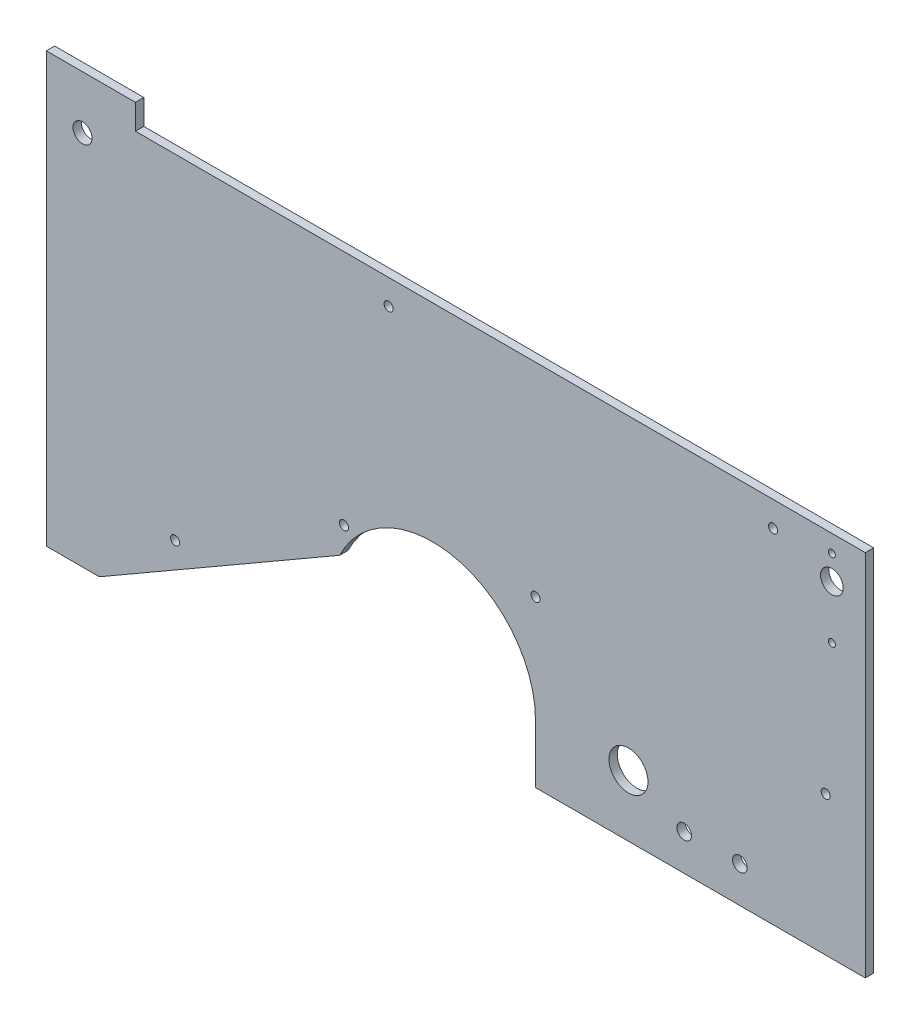
ISO-10303-21;
HEADER;
FILE_DESCRIPTION(('STEP AP214'),'2;1');
FILE_NAME('part.step','',(''),(''),'','','');
FILE_SCHEMA(('AUTOMOTIVE_DESIGN { 1 0 10303 214 1 1 1 1 }'));
ENDSEC;
DATA;
#1=APPLICATION_CONTEXT('core data for automotive mechanical design processes');
#2=APPLICATION_PROTOCOL_DEFINITION('international standard','automotive_design',2000,#1);
#3=PRODUCT_CONTEXT('',#1,'mechanical');
#4=PRODUCT('Part','Part','',(#3));
#5=PRODUCT_RELATED_PRODUCT_CATEGORY('part','',(#4));
#6=PRODUCT_DEFINITION_FORMATION('','',#4);
#7=PRODUCT_DEFINITION_CONTEXT('part definition',#1,'design');
#8=PRODUCT_DEFINITION('design','',#6,#7);
#9=PRODUCT_DEFINITION_SHAPE('','',#8);
#10=(LENGTH_UNIT() NAMED_UNIT(*) SI_UNIT(.MILLI.,.METRE.));
#11=(NAMED_UNIT(*) PLANE_ANGLE_UNIT() SI_UNIT($,.RADIAN.));
#12=(NAMED_UNIT(*) SI_UNIT($,.STERADIAN.) SOLID_ANGLE_UNIT());
#13=UNCERTAINTY_MEASURE_WITH_UNIT(LENGTH_MEASURE(1.E-05),#10,'distance_accuracy_value','');
#14=(GEOMETRIC_REPRESENTATION_CONTEXT(3) GLOBAL_UNCERTAINTY_ASSIGNED_CONTEXT((#13)) GLOBAL_UNIT_ASSIGNED_CONTEXT((#10,
#11,#12)) REPRESENTATION_CONTEXT('',''));
#15=CARTESIAN_POINT('',(0.,0.,0.));
#16=DIRECTION('',(0.,0.,1.));
#17=DIRECTION('',(1.,0.,0.));
#18=AXIS2_PLACEMENT_3D('',#15,#16,#17);
#19=CARTESIAN_POINT('',(144.6,33.7,3.));
#20=DIRECTION('',(0.,0.,1.));
#21=DIRECTION('',(1.,0.,0.));
#22=AXIS2_PLACEMENT_3D('',#19,#20,#21);
#23=PLANE('',#22);
#24=CARTESIAN_POINT('',(112.84,59.93,3.));
#25=DIRECTION('',(0.,0.,1.));
#26=DIRECTION('',(1.,0.,0.));
#27=AXIS2_PLACEMENT_3D('',#24,#25,#26);
#28=CIRCLE('',#27,1.625);
#29=CARTESIAN_POINT('',(114.465,59.93,3.));
#30=VERTEX_POINT('',#29);
#31=EDGE_CURVE('E220',#30,#30,#28,.T.);
#32=ORIENTED_EDGE('',*,*,#31,.F.);
#33=EDGE_LOOP('',(#32));
#34=FACE_BOUND('',#33,.T.);
#35=CARTESIAN_POINT('',(52.23,24.91,3.));
#36=DIRECTION('',(0.,0.,1.));
#37=DIRECTION('',(1.,0.,0.));
#38=AXIS2_PLACEMENT_3D('',#35,#36,#37);
#39=CIRCLE('',#38,1.625);
#40=CARTESIAN_POINT('',(53.855,24.91,3.));
#41=VERTEX_POINT('',#40);
#42=EDGE_CURVE('E242',#41,#41,#39,.T.);
#43=ORIENTED_EDGE('',*,*,#42,.F.);
#44=EDGE_LOOP('',(#43));
#45=FACE_BOUND('',#44,.T.);
#46=CARTESIAN_POINT('',(285.78,62.92,3.));
#47=DIRECTION('',(0.,0.,1.));
#48=DIRECTION('',(1.,0.,0.));
#49=AXIS2_PLACEMENT_3D('',#46,#47,#48);
#50=CIRCLE('',#49,1.62499999999998);
#51=CARTESIAN_POINT('',(287.405,62.92,3.));
#52=VERTEX_POINT('',#51);
#53=EDGE_CURVE('E236',#52,#52,#50,.T.);
#54=ORIENTED_EDGE('',*,*,#53,.F.);
#55=EDGE_LOOP('',(#54));
#56=FACE_BOUND('',#55,.T.);
#57=CARTESIAN_POINT('',(181.6,72.03,3.));
#58=DIRECTION('',(0.,0.,1.));
#59=DIRECTION('',(1.,0.,0.));
#60=AXIS2_PLACEMENT_3D('',#57,#58,#59);
#61=CIRCLE('',#60,1.62499999999998);
#62=CARTESIAN_POINT('',(183.225,72.03,3.));
#63=VERTEX_POINT('',#62);
#64=EDGE_CURVE('E230',#63,#63,#61,.T.);
#65=ORIENTED_EDGE('',*,*,#64,.F.);
#66=EDGE_LOOP('',(#65));
#67=FACE_BOUND('',#66,.T.);
#68=CARTESIAN_POINT('',(234.98,25.75,3.));
#69=DIRECTION('',(0.,0.,1.));
#70=DIRECTION('',(1.,0.,0.));
#71=AXIS2_PLACEMENT_3D('',#68,#69,#70);
#72=CIRCLE('',#71,2.625);
#73=CARTESIAN_POINT('',(237.605,25.75,3.));
#74=VERTEX_POINT('',#73);
#75=EDGE_CURVE('E266',#74,#74,#72,.T.);
#76=ORIENTED_EDGE('',*,*,#75,.F.);
#77=EDGE_LOOP('',(#76));
#78=FACE_BOUND('',#77,.T.);
#79=CARTESIAN_POINT('',(288.,130.,3.));
#80=DIRECTION('',(0.,0.,1.));
#81=DIRECTION('',(1.,0.,0.));
#82=AXIS2_PLACEMENT_3D('',#79,#80,#81);
#83=CIRCLE('',#82,4.07499999999998);
#84=CARTESIAN_POINT('',(292.075,130.,3.));
#85=VERTEX_POINT('',#84);
#86=EDGE_CURVE('E253',#85,#85,#83,.T.);
#87=ORIENTED_EDGE('',*,*,#86,.F.);
#88=EDGE_LOOP('',(#87));
#89=FACE_BOUND('',#88,.T.);
#90=CARTESIAN_POINT('',(288.,138.75,3.));
#91=DIRECTION('',(0.,0.,1.));
#92=DIRECTION('',(1.,0.,0.));
#93=AXIS2_PLACEMENT_3D('',#90,#91,#92);
#94=CIRCLE('',#93,1.24999999999996);
#95=CARTESIAN_POINT('',(289.25,138.75,3.));
#96=VERTEX_POINT('',#95);
#97=EDGE_CURVE('E254',#96,#96,#94,.T.);
#98=ORIENTED_EDGE('',*,*,#97,.F.);
#99=EDGE_LOOP('',(#98));
#100=FACE_BOUND('',#99,.T.);
#101=CARTESIAN_POINT('',(288.,110.95,3.));
#102=DIRECTION('',(0.,0.,1.));
#103=DIRECTION('',(1.,0.,0.));
#104=AXIS2_PLACEMENT_3D('',#101,#102,#103);
#105=CIRCLE('',#104,1.24999999999995);
#106=CARTESIAN_POINT('',(289.25,110.95,3.));
#107=VERTEX_POINT('',#106);
#108=EDGE_CURVE('E229',#107,#107,#105,.T.);
#109=ORIENTED_EDGE('',*,*,#108,.F.);
#110=EDGE_LOOP('',(#109));
#111=FACE_BOUND('',#110,.T.);
#112=CARTESIAN_POINT('',(214.98,34.75,3.));
#113=DIRECTION('',(0.,0.,1.));
#114=DIRECTION('',(1.,0.,0.));
#115=AXIS2_PLACEMENT_3D('',#112,#113,#114);
#116=CIRCLE('',#115,7.00000000000001);
#117=CARTESIAN_POINT('',(221.98,34.75,3.));
#118=VERTEX_POINT('',#117);
#119=EDGE_CURVE('E214',#118,#118,#116,.T.);
#120=ORIENTED_EDGE('',*,*,#119,.F.);
#121=EDGE_LOOP('',(#120));
#122=FACE_BOUND('',#121,.T.);
#123=DIRECTION('',(0.,1.,0.));
#124=VECTOR('',#123,1.);
#125=CARTESIAN_POINT('',(6.,154.,3.));
#126=LINE('',#125,#124);
#127=CARTESIAN_POINT('',(6.00000000000002,0.,3.));
#128=VERTEX_POINT('',#127);
#129=CARTESIAN_POINT('',(6.00000000000002,154.,3.));
#130=VERTEX_POINT('',#129);
#131=EDGE_CURVE('E53',#128,#130,#126,.T.);
#132=ORIENTED_EDGE('',*,*,#131,.F.);
#133=DIRECTION('',(1.,0.,0.));
#134=VECTOR('',#133,1.);
#135=CARTESIAN_POINT('',(0.,0.,3.));
#136=LINE('',#135,#134);
#137=CARTESIAN_POINT('',(25.030359010412,0.,3.));
#138=VERTEX_POINT('',#137);
#139=EDGE_CURVE('E126',#128,#138,#136,.T.);
#140=ORIENTED_EDGE('',*,*,#139,.T.);
#141=DIRECTION('',(0.866025403784438,0.500000000000001,0.));
#142=VECTOR('',#141,1.);
#143=CARTESIAN_POINT('',(25.030359010412,0.,3.));
#144=LINE('',#143,#142);
#145=CARTESIAN_POINT('',(111.286489227342,49.8000000000001,3.));
#146=VERTEX_POINT('',#145);
#147=EDGE_CURVE('E192',#138,#146,#144,.T.);
#148=ORIENTED_EDGE('',*,*,#147,.T.);
#149=CARTESIAN_POINT('',(144.6,33.7,3.));
#150=DIRECTION('',(0.,0.,-1.));
#151=DIRECTION('',(1.,0.,0.));
#152=AXIS2_PLACEMENT_3D('',#149,#150,#151);
#153=CIRCLE('',#152,37.);
#154=CARTESIAN_POINT('',(181.6,33.7,3.));
#155=VERTEX_POINT('',#154);
#156=EDGE_CURVE('E174',#146,#155,#153,.T.);
#157=ORIENTED_EDGE('',*,*,#156,.T.);
#158=DIRECTION('',(0.,-1.,0.));
#159=VECTOR('',#158,1.);
#160=CARTESIAN_POINT('',(181.6,33.7,3.));
#161=LINE('',#160,#159);
#162=CARTESIAN_POINT('',(181.6,12.75,3.));
#163=VERTEX_POINT('',#162);
#164=EDGE_CURVE('E185',#155,#163,#161,.T.);
#165=ORIENTED_EDGE('',*,*,#164,.T.);
#166=DIRECTION('',(-1.,0.,0.));
#167=VECTOR('',#166,1.);
#168=CARTESIAN_POINT('',(181.6,12.75,3.));
#169=LINE('',#168,#167);
#170=CARTESIAN_POINT('',(300.,12.75,3.));
#171=VERTEX_POINT('',#170);
#172=EDGE_CURVE('E277',#171,#163,#169,.T.);
#173=ORIENTED_EDGE('',*,*,#172,.F.);
#174=DIRECTION('',(0.,1.,0.));
#175=VECTOR('',#174,1.);
#176=CARTESIAN_POINT('',(300.,0.,3.));
#177=LINE('',#176,#175);
#178=CARTESIAN_POINT('',(300.,145.,3.));
#179=VERTEX_POINT('',#178);
#180=EDGE_CURVE('E188',#171,#179,#177,.T.);
#181=ORIENTED_EDGE('',*,*,#180,.T.);
#182=DIRECTION('',(-1.,0.,0.));
#183=VECTOR('',#182,1.);
#184=CARTESIAN_POINT('',(38.,145.,3.));
#185=LINE('',#184,#183);
#186=CARTESIAN_POINT('',(38.,145.,3.));
#187=VERTEX_POINT('',#186);
#188=EDGE_CURVE('E190',#179,#187,#185,.T.);
#189=ORIENTED_EDGE('',*,*,#188,.T.);
#190=DIRECTION('',(0.,1.,0.));
#191=VECTOR('',#190,1.);
#192=CARTESIAN_POINT('',(38.,154.,3.));
#193=LINE('',#192,#191);
#194=CARTESIAN_POINT('',(38.,154.,3.));
#195=VERTEX_POINT('',#194);
#196=EDGE_CURVE('E196',#187,#195,#193,.T.);
#197=ORIENTED_EDGE('',*,*,#196,.T.);
#198=DIRECTION('',(-1.,0.,0.));
#199=VECTOR('',#198,1.);
#200=CARTESIAN_POINT('',(19.,154.,3.));
#201=LINE('',#200,#199);
#202=EDGE_CURVE('E141',#195,#130,#201,.T.);
#203=ORIENTED_EDGE('',*,*,#202,.T.);
#204=EDGE_LOOP('',(#132,#140,#148,#157,#165,#173,#181,#189,#197,#203));
#205=FACE_BOUND('',#204,.T.);
#206=CARTESIAN_POINT('',(128.89,135.99,3.));
#207=DIRECTION('',(0.,0.,1.));
#208=DIRECTION('',(1.,0.,0.));
#209=AXIS2_PLACEMENT_3D('',#206,#207,#208);
#210=CIRCLE('',#209,1.62499999999998);
#211=CARTESIAN_POINT('',(130.515,135.99,3.));
#212=VERTEX_POINT('',#211);
#213=EDGE_CURVE('E204',#212,#212,#210,.T.);
#214=ORIENTED_EDGE('',*,*,#213,.F.);
#215=EDGE_LOOP('',(#214));
#216=FACE_BOUND('',#215,.T.);
#217=CARTESIAN_POINT('',(266.89,135.99,3.));
#218=DIRECTION('',(0.,0.,1.));
#219=DIRECTION('',(1.,0.,0.));
#220=AXIS2_PLACEMENT_3D('',#217,#218,#219);
#221=CIRCLE('',#220,1.62499999999998);
#222=CARTESIAN_POINT('',(268.515,135.99,3.));
#223=VERTEX_POINT('',#222);
#224=EDGE_CURVE('E221',#223,#223,#221,.T.);
#225=ORIENTED_EDGE('',*,*,#224,.F.);
#226=EDGE_LOOP('',(#225));
#227=FACE_BOUND('',#226,.T.);
#228=CARTESIAN_POINT('',(254.98,25.75,3.));
#229=DIRECTION('',(0.,0.,1.));
#230=DIRECTION('',(1.,0.,0.));
#231=AXIS2_PLACEMENT_3D('',#228,#229,#230);
#232=CIRCLE('',#231,2.62499999999997);
#233=CARTESIAN_POINT('',(257.605,25.75,3.));
#234=VERTEX_POINT('',#233);
#235=EDGE_CURVE('E265',#234,#234,#232,.T.);
#236=ORIENTED_EDGE('',*,*,#235,.F.);
#237=EDGE_LOOP('',(#236));
#238=FACE_BOUND('',#237,.T.);
#239=CARTESIAN_POINT('',(19.,135.,3.));
#240=DIRECTION('',(0.,0.,1.));
#241=DIRECTION('',(1.,0.,0.));
#242=AXIS2_PLACEMENT_3D('',#239,#240,#241);
#243=CIRCLE('',#242,3.425);
#244=CARTESIAN_POINT('',(22.425,135.,3.));
#245=VERTEX_POINT('',#244);
#246=EDGE_CURVE('E133',#245,#245,#243,.T.);
#247=ORIENTED_EDGE('',*,*,#246,.F.);
#248=EDGE_LOOP('',(#247));
#249=FACE_BOUND('',#248,.T.);
#250=ADVANCED_FACE('F38',(#34,#45,#56,#67,#78,#89,#100,#111,#122,#205,#216,#227,#238,#249),#23,.T.);
#251=CARTESIAN_POINT('',(144.6,33.7,0.));
#252=DIRECTION('',(0.,0.,1.));
#253=DIRECTION('',(1.,0.,0.));
#254=AXIS2_PLACEMENT_3D('',#251,#252,#253);
#255=PLANE('',#254);
#256=CARTESIAN_POINT('',(112.84,59.93,0.));
#257=DIRECTION('',(0.,0.,1.));
#258=DIRECTION('',(1.,0.,0.));
#259=AXIS2_PLACEMENT_3D('',#256,#257,#258);
#260=CIRCLE('',#259,1.625);
#261=CARTESIAN_POINT('',(114.465,59.93,0.));
#262=VERTEX_POINT('',#261);
#263=EDGE_CURVE('E245',#262,#262,#260,.T.);
#264=ORIENTED_EDGE('',*,*,#263,.T.);
#265=EDGE_LOOP('',(#264));
#266=FACE_BOUND('',#265,.T.);
#267=CARTESIAN_POINT('',(52.23,24.91,0.));
#268=DIRECTION('',(0.,0.,1.));
#269=DIRECTION('',(1.,0.,0.));
#270=AXIS2_PLACEMENT_3D('',#267,#268,#269);
#271=CIRCLE('',#270,1.625);
#272=CARTESIAN_POINT('',(53.855,24.91,0.));
#273=VERTEX_POINT('',#272);
#274=EDGE_CURVE('E239',#273,#273,#271,.T.);
#275=ORIENTED_EDGE('',*,*,#274,.T.);
#276=EDGE_LOOP('',(#275));
#277=FACE_BOUND('',#276,.T.);
#278=CARTESIAN_POINT('',(285.78,62.92,0.));
#279=DIRECTION('',(0.,0.,1.));
#280=DIRECTION('',(1.,0.,0.));
#281=AXIS2_PLACEMENT_3D('',#278,#279,#280);
#282=CIRCLE('',#281,1.62499999999998);
#283=CARTESIAN_POINT('',(287.405,62.92,0.));
#284=VERTEX_POINT('',#283);
#285=EDGE_CURVE('E233',#284,#284,#282,.T.);
#286=ORIENTED_EDGE('',*,*,#285,.T.);
#287=EDGE_LOOP('',(#286));
#288=FACE_BOUND('',#287,.T.);
#289=CARTESIAN_POINT('',(181.6,72.03,0.));
#290=DIRECTION('',(0.,0.,1.));
#291=DIRECTION('',(1.,0.,0.));
#292=AXIS2_PLACEMENT_3D('',#289,#290,#291);
#293=CIRCLE('',#292,1.62499999999998);
#294=CARTESIAN_POINT('',(183.225,72.03,0.));
#295=VERTEX_POINT('',#294);
#296=EDGE_CURVE('E226',#295,#295,#293,.T.);
#297=ORIENTED_EDGE('',*,*,#296,.T.);
#298=EDGE_LOOP('',(#297));
#299=FACE_BOUND('',#298,.T.);
#300=CARTESIAN_POINT('',(234.98,25.75,0.));
#301=DIRECTION('',(0.,0.,1.));
#302=DIRECTION('',(1.,0.,0.));
#303=AXIS2_PLACEMENT_3D('',#300,#301,#302);
#304=CIRCLE('',#303,2.625);
#305=CARTESIAN_POINT('',(237.605,25.75,0.));
#306=VERTEX_POINT('',#305);
#307=EDGE_CURVE('E262',#306,#306,#304,.T.);
#308=ORIENTED_EDGE('',*,*,#307,.T.);
#309=EDGE_LOOP('',(#308));
#310=FACE_BOUND('',#309,.T.);
#311=CARTESIAN_POINT('',(288.,130.,0.));
#312=DIRECTION('',(0.,0.,1.));
#313=DIRECTION('',(1.,0.,0.));
#314=AXIS2_PLACEMENT_3D('',#311,#312,#313);
#315=CIRCLE('',#314,4.07499999999998);
#316=CARTESIAN_POINT('',(292.075,130.,0.));
#317=VERTEX_POINT('',#316);
#318=EDGE_CURVE('E269',#317,#317,#315,.T.);
#319=ORIENTED_EDGE('',*,*,#318,.T.);
#320=EDGE_LOOP('',(#319));
#321=FACE_BOUND('',#320,.T.);
#322=CARTESIAN_POINT('',(288.,138.75,0.));
#323=DIRECTION('',(0.,0.,1.));
#324=DIRECTION('',(1.,0.,0.));
#325=AXIS2_PLACEMENT_3D('',#322,#323,#324);
#326=CIRCLE('',#325,1.24999999999996);
#327=CARTESIAN_POINT('',(289.25,138.75,0.));
#328=VERTEX_POINT('',#327);
#329=EDGE_CURVE('E250',#328,#328,#326,.T.);
#330=ORIENTED_EDGE('',*,*,#329,.T.);
#331=EDGE_LOOP('',(#330));
#332=FACE_BOUND('',#331,.T.);
#333=CARTESIAN_POINT('',(288.,110.95,0.));
#334=DIRECTION('',(0.,0.,1.));
#335=DIRECTION('',(1.,0.,0.));
#336=AXIS2_PLACEMENT_3D('',#333,#334,#335);
#337=CIRCLE('',#336,1.24999999999995);
#338=CARTESIAN_POINT('',(289.25,110.95,0.));
#339=VERTEX_POINT('',#338);
#340=EDGE_CURVE('E257',#339,#339,#337,.T.);
#341=ORIENTED_EDGE('',*,*,#340,.T.);
#342=EDGE_LOOP('',(#341));
#343=FACE_BOUND('',#342,.T.);
#344=CARTESIAN_POINT('',(214.98,34.75,0.));
#345=DIRECTION('',(0.,0.,1.));
#346=DIRECTION('',(1.,0.,0.));
#347=AXIS2_PLACEMENT_3D('',#344,#345,#346);
#348=CIRCLE('',#347,7.00000000000001);
#349=CARTESIAN_POINT('',(221.98,34.75,0.));
#350=VERTEX_POINT('',#349);
#351=EDGE_CURVE('E211',#350,#350,#348,.T.);
#352=ORIENTED_EDGE('',*,*,#351,.T.);
#353=EDGE_LOOP('',(#352));
#354=FACE_BOUND('',#353,.T.);
#355=CARTESIAN_POINT('',(128.89,135.99,0.));
#356=DIRECTION('',(0.,0.,1.));
#357=DIRECTION('',(1.,0.,0.));
#358=AXIS2_PLACEMENT_3D('',#355,#356,#357);
#359=CIRCLE('',#358,1.62499999999998);
#360=CARTESIAN_POINT('',(130.515,135.99,0.));
#361=VERTEX_POINT('',#360);
#362=EDGE_CURVE('E207',#361,#361,#359,.T.);
#363=ORIENTED_EDGE('',*,*,#362,.T.);
#364=EDGE_LOOP('',(#363));
#365=FACE_BOUND('',#364,.T.);
#366=CARTESIAN_POINT('',(266.89,135.99,0.));
#367=DIRECTION('',(0.,0.,1.));
#368=DIRECTION('',(1.,0.,0.));
#369=AXIS2_PLACEMENT_3D('',#366,#367,#368);
#370=CIRCLE('',#369,1.62499999999998);
#371=CARTESIAN_POINT('',(268.515,135.99,0.));
#372=VERTEX_POINT('',#371);
#373=EDGE_CURVE('E217',#372,#372,#370,.T.);
#374=ORIENTED_EDGE('',*,*,#373,.T.);
#375=EDGE_LOOP('',(#374));
#376=FACE_BOUND('',#375,.T.);
#377=CARTESIAN_POINT('',(254.98,25.75,0.));
#378=DIRECTION('',(0.,0.,1.));
#379=DIRECTION('',(1.,0.,0.));
#380=AXIS2_PLACEMENT_3D('',#377,#378,#379);
#381=CIRCLE('',#380,2.62499999999997);
#382=CARTESIAN_POINT('',(257.605,25.75,0.));
#383=VERTEX_POINT('',#382);
#384=EDGE_CURVE('E274',#383,#383,#381,.T.);
#385=ORIENTED_EDGE('',*,*,#384,.T.);
#386=EDGE_LOOP('',(#385));
#387=FACE_BOUND('',#386,.T.);
#388=DIRECTION('',(1.,0.,0.));
#389=VECTOR('',#388,1.);
#390=CARTESIAN_POINT('',(0.,0.,0.));
#391=LINE('',#390,#389);
#392=CARTESIAN_POINT('',(6.00000000000002,0.,0.));
#393=VERTEX_POINT('',#392);
#394=CARTESIAN_POINT('',(25.030359010412,0.,0.));
#395=VERTEX_POINT('',#394);
#396=EDGE_CURVE('E125',#393,#395,#391,.T.);
#397=ORIENTED_EDGE('',*,*,#396,.F.);
#398=DIRECTION('',(0.,1.,0.));
#399=VECTOR('',#398,1.);
#400=CARTESIAN_POINT('',(6.,154.,0.));
#401=LINE('',#400,#399);
#402=CARTESIAN_POINT('',(6.,154.,0.));
#403=VERTEX_POINT('',#402);
#404=EDGE_CURVE('E113',#393,#403,#401,.T.);
#405=ORIENTED_EDGE('',*,*,#404,.T.);
#406=DIRECTION('',(-1.,0.,0.));
#407=VECTOR('',#406,1.);
#408=CARTESIAN_POINT('',(0.,154.,0.));
#409=LINE('',#408,#407);
#410=CARTESIAN_POINT('',(38.,154.,0.));
#411=VERTEX_POINT('',#410);
#412=EDGE_CURVE('E155',#411,#403,#409,.T.);
#413=ORIENTED_EDGE('',*,*,#412,.F.);
#414=DIRECTION('',(0.,1.,0.));
#415=VECTOR('',#414,1.);
#416=CARTESIAN_POINT('',(38.,154.,0.));
#417=LINE('',#416,#415);
#418=CARTESIAN_POINT('',(38.,145.,0.));
#419=VERTEX_POINT('',#418);
#420=EDGE_CURVE('E152',#419,#411,#417,.T.);
#421=ORIENTED_EDGE('',*,*,#420,.F.);
#422=DIRECTION('',(-1.,0.,0.));
#423=VECTOR('',#422,1.);
#424=CARTESIAN_POINT('',(38.,145.,0.));
#425=LINE('',#424,#423);
#426=CARTESIAN_POINT('',(300.,145.,0.));
#427=VERTEX_POINT('',#426);
#428=EDGE_CURVE('E150',#427,#419,#425,.T.);
#429=ORIENTED_EDGE('',*,*,#428,.F.);
#430=DIRECTION('',(0.,1.,0.));
#431=VECTOR('',#430,1.);
#432=CARTESIAN_POINT('',(300.,0.,0.));
#433=LINE('',#432,#431);
#434=CARTESIAN_POINT('',(300.,12.75,0.));
#435=VERTEX_POINT('',#434);
#436=EDGE_CURVE('E148',#435,#427,#433,.T.);
#437=ORIENTED_EDGE('',*,*,#436,.F.);
#438=DIRECTION('',(-1.,0.,0.));
#439=VECTOR('',#438,1.);
#440=CARTESIAN_POINT('',(181.6,12.75,0.));
#441=LINE('',#440,#439);
#442=CARTESIAN_POINT('',(181.6,12.75,0.));
#443=VERTEX_POINT('',#442);
#444=EDGE_CURVE('E61',#435,#443,#441,.T.);
#445=ORIENTED_EDGE('',*,*,#444,.T.);
#446=DIRECTION('',(0.,-1.,0.));
#447=VECTOR('',#446,1.);
#448=CARTESIAN_POINT('',(181.6,33.7,0.));
#449=LINE('',#448,#447);
#450=CARTESIAN_POINT('',(181.6,33.7,0.));
#451=VERTEX_POINT('',#450);
#452=EDGE_CURVE('E145',#451,#443,#449,.T.);
#453=ORIENTED_EDGE('',*,*,#452,.F.);
#454=CARTESIAN_POINT('',(144.6,33.7,0.));
#455=DIRECTION('',(0.,0.,-1.));
#456=DIRECTION('',(1.,0.,0.));
#457=AXIS2_PLACEMENT_3D('',#454,#455,#456);
#458=CIRCLE('',#457,37.);
#459=CARTESIAN_POINT('',(111.286489227342,49.8000000000001,0.));
#460=VERTEX_POINT('',#459);
#461=EDGE_CURVE('E135',#460,#451,#458,.T.);
#462=ORIENTED_EDGE('',*,*,#461,.F.);
#463=DIRECTION('',(0.866025403784438,0.500000000000001,0.));
#464=VECTOR('',#463,1.);
#465=CARTESIAN_POINT('',(25.030359010412,0.,0.));
#466=LINE('',#465,#464);
#467=EDGE_CURVE('E132',#395,#460,#466,.T.);
#468=ORIENTED_EDGE('',*,*,#467,.F.);
#469=EDGE_LOOP('',(#397,#405,#413,#421,#429,#437,#445,#453,#462,#468));
#470=FACE_BOUND('',#469,.T.);
#471=CARTESIAN_POINT('',(19.,135.,0.));
#472=DIRECTION('',(0.,0.,1.));
#473=DIRECTION('',(1.,0.,0.));
#474=AXIS2_PLACEMENT_3D('',#471,#472,#473);
#475=CIRCLE('',#474,3.425);
#476=CARTESIAN_POINT('',(22.425,135.,0.));
#477=VERTEX_POINT('',#476);
#478=EDGE_CURVE('E138',#477,#477,#475,.T.);
#479=ORIENTED_EDGE('',*,*,#478,.T.);
#480=EDGE_LOOP('',(#479));
#481=FACE_BOUND('',#480,.T.);
#482=ADVANCED_FACE('F129',(#266,#277,#288,#299,#310,#321,#332,#343,#354,#365,#376,#387,#470,
#481),#255,.F.);
#483=CARTESIAN_POINT('',(0.,0.,3.));
#484=DIRECTION('',(0.,1.,0.));
#485=DIRECTION('',(0.,0.,1.));
#486=AXIS2_PLACEMENT_3D('',#483,#484,#485);
#487=PLANE('',#486);
#488=ORIENTED_EDGE('',*,*,#139,.F.);
#489=DIRECTION('',(0.,0.,1.));
#490=VECTOR('',#489,1.);
#491=CARTESIAN_POINT('',(6.00000000000002,0.,0.));
#492=LINE('',#491,#490);
#493=EDGE_CURVE('E116',#393,#128,#492,.T.);
#494=ORIENTED_EDGE('',*,*,#493,.F.);
#495=ORIENTED_EDGE('',*,*,#396,.T.);
#496=DIRECTION('',(0.,0.,-1.));
#497=VECTOR('',#496,1.);
#498=CARTESIAN_POINT('',(25.030359010412,0.,3.));
#499=LINE('',#498,#497);
#500=EDGE_CURVE('E11',#138,#395,#499,.T.);
#501=ORIENTED_EDGE('',*,*,#500,.F.);
#502=EDGE_LOOP('',(#488,#494,#495,#501));
#503=FACE_BOUND('',#502,.T.);
#504=ADVANCED_FACE('F40',(#503),#487,.F.);
#505=CARTESIAN_POINT('',(25.030359010412,0.,3.));
#506=DIRECTION('',(-0.500000000000001,0.866025403784438,0.));
#507=DIRECTION('',(-0.866025403784438,-0.500000000000001,0.));
#508=AXIS2_PLACEMENT_3D('',#505,#506,#507);
#509=PLANE('',#508);
#510=ORIENTED_EDGE('',*,*,#467,.T.);
#511=DIRECTION('',(0.,0.,-1.));
#512=VECTOR('',#511,1.);
#513=CARTESIAN_POINT('',(111.286489227342,49.8000000000001,3.));
#514=LINE('',#513,#512);
#515=EDGE_CURVE('E46',#146,#460,#514,.T.);
#516=ORIENTED_EDGE('',*,*,#515,.F.);
#517=ORIENTED_EDGE('',*,*,#147,.F.);
#518=ORIENTED_EDGE('',*,*,#500,.T.);
#519=EDGE_LOOP('',(#510,#516,#517,#518));
#520=FACE_BOUND('',#519,.T.);
#521=ADVANCED_FACE('F287',(#520),#509,.F.);
#522=CARTESIAN_POINT('',(144.6,33.7,3.));
#523=DIRECTION('',(0.,0.,-1.));
#524=DIRECTION('',(-1.,0.,0.));
#525=AXIS2_PLACEMENT_3D('',#522,#523,#524);
#526=CYLINDRICAL_SURFACE('',#525,37.);
#527=ORIENTED_EDGE('',*,*,#461,.T.);
#528=DIRECTION('',(0.,0.,-1.));
#529=VECTOR('',#528,1.);
#530=CARTESIAN_POINT('',(181.6,33.7,3.));
#531=LINE('',#530,#529);
#532=EDGE_CURVE('E166',#155,#451,#531,.T.);
#533=ORIENTED_EDGE('',*,*,#532,.F.);
#534=ORIENTED_EDGE('',*,*,#156,.F.);
#535=ORIENTED_EDGE('',*,*,#515,.T.);
#536=EDGE_LOOP('',(#527,#533,#534,#535));
#537=FACE_BOUND('',#536,.T.);
#538=ADVANCED_FACE('F172',(#537),#526,.F.);
#539=CARTESIAN_POINT('',(181.6,33.7,3.));
#540=DIRECTION('',(1.,0.,0.));
#541=DIRECTION('',(0.,0.,-1.));
#542=AXIS2_PLACEMENT_3D('',#539,#540,#541);
#543=PLANE('',#542);
#544=ORIENTED_EDGE('',*,*,#452,.T.);
#545=DIRECTION('',(0.,0.,1.));
#546=VECTOR('',#545,1.);
#547=CARTESIAN_POINT('',(181.6,12.75,0.));
#548=LINE('',#547,#546);
#549=EDGE_CURVE('E183',#443,#163,#548,.T.);
#550=ORIENTED_EDGE('',*,*,#549,.T.);
#551=ORIENTED_EDGE('',*,*,#164,.F.);
#552=ORIENTED_EDGE('',*,*,#532,.T.);
#553=EDGE_LOOP('',(#544,#550,#551,#552));
#554=FACE_BOUND('',#553,.T.);
#555=ADVANCED_FACE('F181',(#554),#543,.F.);
#556=CARTESIAN_POINT('',(300.,0.,3.));
#557=DIRECTION('',(-1.,0.,0.));
#558=DIRECTION('',(0.,0.,1.));
#559=AXIS2_PLACEMENT_3D('',#556,#557,#558);
#560=PLANE('',#559);
#561=ORIENTED_EDGE('',*,*,#180,.F.);
#562=DIRECTION('',(0.,0.,1.));
#563=VECTOR('',#562,1.);
#564=CARTESIAN_POINT('',(300.,12.75,0.));
#565=LINE('',#564,#563);
#566=EDGE_CURVE('E281',#435,#171,#565,.T.);
#567=ORIENTED_EDGE('',*,*,#566,.F.);
#568=ORIENTED_EDGE('',*,*,#436,.T.);
#569=DIRECTION('',(0.,0.,-1.));
#570=VECTOR('',#569,1.);
#571=CARTESIAN_POINT('',(300.,145.,3.));
#572=LINE('',#571,#570);
#573=EDGE_CURVE('E163',#179,#427,#572,.T.);
#574=ORIENTED_EDGE('',*,*,#573,.F.);
#575=EDGE_LOOP('',(#561,#567,#568,#574));
#576=FACE_BOUND('',#575,.T.);
#577=ADVANCED_FACE('F317',(#576),#560,.F.);
#578=CARTESIAN_POINT('',(38.,145.,3.));
#579=DIRECTION('',(0.,-1.,0.));
#580=DIRECTION('',(0.,0.,-1.));
#581=AXIS2_PLACEMENT_3D('',#578,#579,#580);
#582=PLANE('',#581);
#583=ORIENTED_EDGE('',*,*,#428,.T.);
#584=DIRECTION('',(0.,0.,-1.));
#585=VECTOR('',#584,1.);
#586=CARTESIAN_POINT('',(38.,145.,3.));
#587=LINE('',#586,#585);
#588=EDGE_CURVE('E160',#187,#419,#587,.T.);
#589=ORIENTED_EDGE('',*,*,#588,.F.);
#590=ORIENTED_EDGE('',*,*,#188,.F.);
#591=ORIENTED_EDGE('',*,*,#573,.T.);
#592=EDGE_LOOP('',(#583,#589,#590,#591));
#593=FACE_BOUND('',#592,.T.);
#594=ADVANCED_FACE('F313',(#593),#582,.F.);
#595=CARTESIAN_POINT('',(38.,154.,3.));
#596=DIRECTION('',(-1.,0.,0.));
#597=DIRECTION('',(0.,0.,1.));
#598=AXIS2_PLACEMENT_3D('',#595,#596,#597);
#599=PLANE('',#598);
#600=ORIENTED_EDGE('',*,*,#420,.T.);
#601=DIRECTION('',(0.,0.,-1.));
#602=VECTOR('',#601,1.);
#603=CARTESIAN_POINT('',(38.,154.,3.));
#604=LINE('',#603,#602);
#605=EDGE_CURVE('E157',#195,#411,#604,.T.);
#606=ORIENTED_EDGE('',*,*,#605,.F.);
#607=ORIENTED_EDGE('',*,*,#196,.F.);
#608=ORIENTED_EDGE('',*,*,#588,.T.);
#609=EDGE_LOOP('',(#600,#606,#607,#608));
#610=FACE_BOUND('',#609,.T.);
#611=ADVANCED_FACE('F310',(#610),#599,.F.);
#612=CARTESIAN_POINT('',(0.,154.,3.));
#613=DIRECTION('',(0.,-1.,0.));
#614=DIRECTION('',(0.,0.,-1.));
#615=AXIS2_PLACEMENT_3D('',#612,#613,#614);
#616=PLANE('',#615);
#617=ORIENTED_EDGE('',*,*,#412,.T.);
#618=DIRECTION('',(0.,0.,1.));
#619=VECTOR('',#618,1.);
#620=CARTESIAN_POINT('',(6.,154.,0.));
#621=LINE('',#620,#619);
#622=EDGE_CURVE('E117',#403,#130,#621,.T.);
#623=ORIENTED_EDGE('',*,*,#622,.T.);
#624=ORIENTED_EDGE('',*,*,#202,.F.);
#625=ORIENTED_EDGE('',*,*,#605,.T.);
#626=EDGE_LOOP('',(#617,#623,#624,#625));
#627=FACE_BOUND('',#626,.T.);
#628=ADVANCED_FACE('F203',(#627),#616,.F.);
#629=CARTESIAN_POINT('',(19.,135.,3.));
#630=DIRECTION('',(0.,0.,-1.));
#631=DIRECTION('',(-1.,0.,0.));
#632=AXIS2_PLACEMENT_3D('',#629,#630,#631);
#633=CYLINDRICAL_SURFACE('',#632,3.425);
#634=ORIENTED_EDGE('',*,*,#246,.T.);
#635=EDGE_LOOP('',(#634));
#636=FACE_BOUND('',#635,.T.);
#637=ORIENTED_EDGE('',*,*,#478,.F.);
#638=EDGE_LOOP('',(#637));
#639=FACE_BOUND('',#638,.T.);
#640=ADVANCED_FACE('F305',(#636,#639),#633,.F.);
#641=CARTESIAN_POINT('',(181.6,12.75,0.));
#642=DIRECTION('',(0.,1.,0.));
#643=DIRECTION('',(-1.,0.,0.));
#644=AXIS2_PLACEMENT_3D('',#641,#642,#643);
#645=PLANE('',#644);
#646=ORIENTED_EDGE('',*,*,#172,.T.);
#647=ORIENTED_EDGE('',*,*,#549,.F.);
#648=ORIENTED_EDGE('',*,*,#444,.F.);
#649=ORIENTED_EDGE('',*,*,#566,.T.);
#650=EDGE_LOOP('',(#646,#647,#648,#649));
#651=FACE_BOUND('',#650,.T.);
#652=ADVANCED_FACE('F352',(#651),#645,.F.);
#653=CARTESIAN_POINT('',(6.,154.,0.));
#654=DIRECTION('',(1.,0.,0.));
#655=DIRECTION('',(0.,1.,0.));
#656=AXIS2_PLACEMENT_3D('',#653,#654,#655);
#657=PLANE('',#656);
#658=ORIENTED_EDGE('',*,*,#131,.T.);
#659=ORIENTED_EDGE('',*,*,#622,.F.);
#660=ORIENTED_EDGE('',*,*,#404,.F.);
#661=ORIENTED_EDGE('',*,*,#493,.T.);
#662=EDGE_LOOP('',(#658,#659,#660,#661));
#663=FACE_BOUND('',#662,.T.);
#664=ADVANCED_FACE('F115',(#663),#657,.F.);
#665=CARTESIAN_POINT('',(254.98,25.75,0.));
#666=DIRECTION('',(0.,0.,1.));
#667=DIRECTION('',(1.,0.,0.));
#668=AXIS2_PLACEMENT_3D('',#665,#666,#667);
#669=CYLINDRICAL_SURFACE('',#668,2.62499999999997);
#670=ORIENTED_EDGE('',*,*,#384,.F.);
#671=EDGE_LOOP('',(#670));
#672=FACE_BOUND('',#671,.T.);
#673=ORIENTED_EDGE('',*,*,#235,.T.);
#674=EDGE_LOOP('',(#673));
#675=FACE_BOUND('',#674,.T.);
#676=ADVANCED_FACE('F362',(#672,#675),#669,.F.);
#677=CARTESIAN_POINT('',(266.89,135.99,0.));
#678=DIRECTION('',(0.,0.,1.));
#679=DIRECTION('',(1.,0.,0.));
#680=AXIS2_PLACEMENT_3D('',#677,#678,#679);
#681=CYLINDRICAL_SURFACE('',#680,1.62499999999998);
#682=ORIENTED_EDGE('',*,*,#373,.F.);
#683=EDGE_LOOP('',(#682));
#684=FACE_BOUND('',#683,.T.);
#685=ORIENTED_EDGE('',*,*,#224,.T.);
#686=EDGE_LOOP('',(#685));
#687=FACE_BOUND('',#686,.T.);
#688=ADVANCED_FACE('F369',(#684,#687),#681,.F.);
#689=CARTESIAN_POINT('',(128.89,135.99,0.));
#690=DIRECTION('',(0.,0.,1.));
#691=DIRECTION('',(1.,0.,0.));
#692=AXIS2_PLACEMENT_3D('',#689,#690,#691);
#693=CYLINDRICAL_SURFACE('',#692,1.62499999999998);
#694=ORIENTED_EDGE('',*,*,#362,.F.);
#695=EDGE_LOOP('',(#694));
#696=FACE_BOUND('',#695,.T.);
#697=ORIENTED_EDGE('',*,*,#213,.T.);
#698=EDGE_LOOP('',(#697));
#699=FACE_BOUND('',#698,.T.);
#700=ADVANCED_FACE('F377',(#696,#699),#693,.F.);
#701=CARTESIAN_POINT('',(214.98,34.75,0.));
#702=DIRECTION('',(0.,0.,1.));
#703=DIRECTION('',(1.,0.,0.));
#704=AXIS2_PLACEMENT_3D('',#701,#702,#703);
#705=CYLINDRICAL_SURFACE('',#704,7.00000000000001);
#706=ORIENTED_EDGE('',*,*,#351,.F.);
#707=EDGE_LOOP('',(#706));
#708=FACE_BOUND('',#707,.T.);
#709=ORIENTED_EDGE('',*,*,#119,.T.);
#710=EDGE_LOOP('',(#709));
#711=FACE_BOUND('',#710,.T.);
#712=ADVANCED_FACE('F385',(#708,#711),#705,.F.);
#713=CARTESIAN_POINT('',(288.,110.95,0.));
#714=DIRECTION('',(0.,0.,1.));
#715=DIRECTION('',(1.,0.,0.));
#716=AXIS2_PLACEMENT_3D('',#713,#714,#715);
#717=CYLINDRICAL_SURFACE('',#716,1.24999999999995);
#718=ORIENTED_EDGE('',*,*,#340,.F.);
#719=EDGE_LOOP('',(#718));
#720=FACE_BOUND('',#719,.T.);
#721=ORIENTED_EDGE('',*,*,#108,.T.);
#722=EDGE_LOOP('',(#721));
#723=FACE_BOUND('',#722,.T.);
#724=ADVANCED_FACE('F393',(#720,#723),#717,.F.);
#725=CARTESIAN_POINT('',(288.,138.75,0.));
#726=DIRECTION('',(0.,0.,1.));
#727=DIRECTION('',(1.,0.,0.));
#728=AXIS2_PLACEMENT_3D('',#725,#726,#727);
#729=CYLINDRICAL_SURFACE('',#728,1.24999999999996);
#730=ORIENTED_EDGE('',*,*,#329,.F.);
#731=EDGE_LOOP('',(#730));
#732=FACE_BOUND('',#731,.T.);
#733=ORIENTED_EDGE('',*,*,#97,.T.);
#734=EDGE_LOOP('',(#733));
#735=FACE_BOUND('',#734,.T.);
#736=ADVANCED_FACE('F401',(#732,#735),#729,.F.);
#737=CARTESIAN_POINT('',(288.,130.,0.));
#738=DIRECTION('',(0.,0.,1.));
#739=DIRECTION('',(1.,0.,0.));
#740=AXIS2_PLACEMENT_3D('',#737,#738,#739);
#741=CYLINDRICAL_SURFACE('',#740,4.07499999999998);
#742=ORIENTED_EDGE('',*,*,#318,.F.);
#743=EDGE_LOOP('',(#742));
#744=FACE_BOUND('',#743,.T.);
#745=ORIENTED_EDGE('',*,*,#86,.T.);
#746=EDGE_LOOP('',(#745));
#747=FACE_BOUND('',#746,.T.);
#748=ADVANCED_FACE('F409',(#744,#747),#741,.F.);
#749=CARTESIAN_POINT('',(234.98,25.75,0.));
#750=DIRECTION('',(0.,0.,1.));
#751=DIRECTION('',(1.,0.,0.));
#752=AXIS2_PLACEMENT_3D('',#749,#750,#751);
#753=CYLINDRICAL_SURFACE('',#752,2.625);
#754=ORIENTED_EDGE('',*,*,#307,.F.);
#755=EDGE_LOOP('',(#754));
#756=FACE_BOUND('',#755,.T.);
#757=ORIENTED_EDGE('',*,*,#75,.T.);
#758=EDGE_LOOP('',(#757));
#759=FACE_BOUND('',#758,.T.);
#760=ADVANCED_FACE('F417',(#756,#759),#753,.F.);
#761=CARTESIAN_POINT('',(181.6,72.03,0.));
#762=DIRECTION('',(0.,0.,1.));
#763=DIRECTION('',(1.,0.,0.));
#764=AXIS2_PLACEMENT_3D('',#761,#762,#763);
#765=CYLINDRICAL_SURFACE('',#764,1.62499999999998);
#766=ORIENTED_EDGE('',*,*,#296,.F.);
#767=EDGE_LOOP('',(#766));
#768=FACE_BOUND('',#767,.T.);
#769=ORIENTED_EDGE('',*,*,#64,.T.);
#770=EDGE_LOOP('',(#769));
#771=FACE_BOUND('',#770,.T.);
#772=ADVANCED_FACE('F425',(#768,#771),#765,.F.);
#773=CARTESIAN_POINT('',(285.78,62.92,0.));
#774=DIRECTION('',(0.,0.,1.));
#775=DIRECTION('',(1.,0.,0.));
#776=AXIS2_PLACEMENT_3D('',#773,#774,#775);
#777=CYLINDRICAL_SURFACE('',#776,1.62499999999998);
#778=ORIENTED_EDGE('',*,*,#285,.F.);
#779=EDGE_LOOP('',(#778));
#780=FACE_BOUND('',#779,.T.);
#781=ORIENTED_EDGE('',*,*,#53,.T.);
#782=EDGE_LOOP('',(#781));
#783=FACE_BOUND('',#782,.T.);
#784=ADVANCED_FACE('F433',(#780,#783),#777,.F.);
#785=CARTESIAN_POINT('',(52.23,24.91,0.));
#786=DIRECTION('',(0.,0.,1.));
#787=DIRECTION('',(1.,0.,0.));
#788=AXIS2_PLACEMENT_3D('',#785,#786,#787);
#789=CYLINDRICAL_SURFACE('',#788,1.625);
#790=ORIENTED_EDGE('',*,*,#274,.F.);
#791=EDGE_LOOP('',(#790));
#792=FACE_BOUND('',#791,.T.);
#793=ORIENTED_EDGE('',*,*,#42,.T.);
#794=EDGE_LOOP('',(#793));
#795=FACE_BOUND('',#794,.T.);
#796=ADVANCED_FACE('F441',(#792,#795),#789,.F.);
#797=CARTESIAN_POINT('',(112.84,59.93,0.));
#798=DIRECTION('',(0.,0.,1.));
#799=DIRECTION('',(1.,0.,0.));
#800=AXIS2_PLACEMENT_3D('',#797,#798,#799);
#801=CYLINDRICAL_SURFACE('',#800,1.625);
#802=ORIENTED_EDGE('',*,*,#263,.F.);
#803=EDGE_LOOP('',(#802));
#804=FACE_BOUND('',#803,.T.);
#805=ORIENTED_EDGE('',*,*,#31,.T.);
#806=EDGE_LOOP('',(#805));
#807=FACE_BOUND('',#806,.T.);
#808=ADVANCED_FACE('F449',(#804,#807),#801,.F.);
#809=CLOSED_SHELL('',(#250,#482,#504,#521,#538,#555,#577,#594,#611,#628,#640,#652,#664,#676,
#688,#700,#712,#724,#736,#748,#760,#772,#784,#796,#808));
#810=MANIFOLD_SOLID_BREP('B2',#809);
#811=ADVANCED_BREP_SHAPE_REPRESENTATION('',(#18,#810),#14);
#812=SHAPE_DEFINITION_REPRESENTATION(#9,#811);
ENDSEC;
END-ISO-10303-21;
